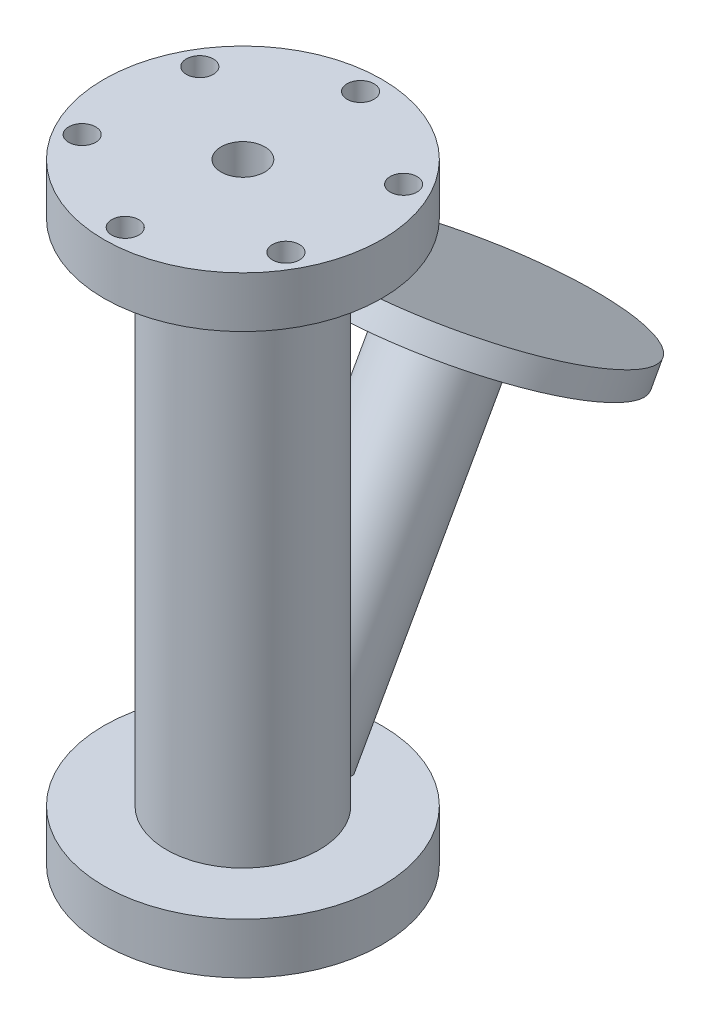
ISO-10303-21;
HEADER;
FILE_DESCRIPTION(('STEP AP214'),'2;1');
FILE_NAME('part.step','',(''),(''),'','','');
FILE_SCHEMA(('AUTOMOTIVE_DESIGN { 1 0 10303 214 1 1 1 1 }'));
ENDSEC;
DATA;
#1=APPLICATION_CONTEXT('core data for automotive mechanical design processes');
#2=APPLICATION_PROTOCOL_DEFINITION('international standard','automotive_design',2000,#1);
#3=PRODUCT_CONTEXT('',#1,'mechanical');
#4=PRODUCT('Part','Part','',(#3));
#5=PRODUCT_RELATED_PRODUCT_CATEGORY('part','',(#4));
#6=PRODUCT_DEFINITION_FORMATION('','',#4);
#7=PRODUCT_DEFINITION_CONTEXT('part definition',#1,'design');
#8=PRODUCT_DEFINITION('design','',#6,#7);
#9=PRODUCT_DEFINITION_SHAPE('','',#8);
#10=(LENGTH_UNIT() NAMED_UNIT(*) SI_UNIT(.MILLI.,.METRE.));
#11=(NAMED_UNIT(*) PLANE_ANGLE_UNIT() SI_UNIT($,.RADIAN.));
#12=(NAMED_UNIT(*) SI_UNIT($,.STERADIAN.) SOLID_ANGLE_UNIT());
#13=UNCERTAINTY_MEASURE_WITH_UNIT(LENGTH_MEASURE(1.E-05),#10,'distance_accuracy_value','');
#14=(GEOMETRIC_REPRESENTATION_CONTEXT(3) GLOBAL_UNCERTAINTY_ASSIGNED_CONTEXT((#13)) GLOBAL_UNIT_ASSIGNED_CONTEXT((#10,
#11,#12)) REPRESENTATION_CONTEXT('',''));
#15=CARTESIAN_POINT('',(0.,0.,0.));
#16=DIRECTION('',(0.,0.,1.));
#17=DIRECTION('',(1.,0.,0.));
#18=AXIS2_PLACEMENT_3D('',#15,#16,#17);
#19=CARTESIAN_POINT('',(0.,152.4,0.));
#20=DIRECTION('',(0.,-1.,0.));
#21=DIRECTION('',(0.,0.,-1.));
#22=AXIS2_PLACEMENT_3D('',#19,#20,#21);
#23=CYLINDRICAL_SURFACE('',#22,19.05);
#24=CARTESIAN_POINT('',(0.,25.8111800412419,0.));
#25=DIRECTION('',(0.,0.873081175094353,-0.487574878040147));
#26=DIRECTION('',(0.,-0.487574878040147,-0.873081175094353));
#27=AXIS2_PLACEMENT_3D('',#24,#25,#26);
#28=ELLIPSE('',#27,21.8192769967137,19.05);
#29=CARTESIAN_POINT('',(11.8901587608163,17.4992924424781,-14.8837705116205));
#30=VERTEX_POINT('',#29);
#31=CARTESIAN_POINT('',(-11.8901587608163,17.4992924424781,-14.8837705116205));
#32=VERTEX_POINT('',#31);
#33=EDGE_CURVE('E45',#30,#32,#28,.T.);
#34=ORIENTED_EDGE('',*,*,#33,.F.);
#35=CARTESIAN_POINT('',(11.8901587608163,17.4992924424781,-14.8837705116205));
#36=CARTESIAN_POINT('',(11.9715870961043,17.8279417549045,-14.8186671744751));
#37=CARTESIAN_POINT('',(12.0451097767677,18.1594892433178,-14.7588896927462));
#38=CARTESIAN_POINT('',(12.1779185235066,18.8268792067728,-14.6495257617463));
#39=CARTESIAN_POINT('',(12.2372135535328,19.1627188363624,-14.5999328986395));
#40=CARTESIAN_POINT('',(12.3430713660675,19.8365337253275,-14.5105393423938));
#41=CARTESIAN_POINT('',(12.3896741616893,20.1744987542862,-14.4707079164069));
#42=CARTESIAN_POINT('',(12.471799483745,20.8527462495922,-14.3999887879697));
#43=CARTESIAN_POINT('',(12.5073200571466,21.1930291136293,-14.3691026620281));
#44=CARTESIAN_POINT('',(12.5681592341849,21.8713036703718,-14.3159167533342));
#45=CARTESIAN_POINT('',(12.5935872817595,22.2092785439872,-14.2935249820681));
#46=CARTESIAN_POINT('',(12.6358278283109,22.8861808278136,-14.2561967890096));
#47=CARTESIAN_POINT('',(12.6526399084576,23.2251082835254,-14.2412607296471));
#48=CARTESIAN_POINT('',(12.6785357452392,23.9037818410074,-14.218211155744));
#49=CARTESIAN_POINT('',(12.6876126254117,24.2435284024887,-14.2101037118017));
#50=CARTESIAN_POINT('',(12.6987580726691,24.9232322870038,-14.2001441362731));
#51=CARTESIAN_POINT('',(12.7008263418991,25.2631896183807,-14.1982922705391));
#52=CARTESIAN_POINT('',(12.6982242035043,26.0532630733695,-14.2006203410835));
#53=CARTESIAN_POINT('',(12.6911520299332,26.5033653363735,-14.2069501606969));
#54=CARTESIAN_POINT('',(12.6670242756357,27.4031080535781,-14.2284660392265));
#55=CARTESIAN_POINT('',(12.6499678451866,27.8527484652092,-14.2436528519279));
#56=CARTESIAN_POINT('',(12.6067980590263,28.7513916608555,-14.2818756455167));
#57=CARTESIAN_POINT('',(12.5806818838169,29.2003942026281,-14.3049140698779));
#58=CARTESIAN_POINT('',(12.5201197932199,30.0974385427896,-14.3579496247138));
#59=CARTESIAN_POINT('',(12.4856734732221,30.5454802934442,-14.3879470931989));
#60=CARTESIAN_POINT('',(12.4089562117622,31.4410467392678,-14.45416470281));
#61=CARTESIAN_POINT('',(12.3666746679862,31.8885698970287,-14.4903932707813));
#62=CARTESIAN_POINT('',(12.2747267178258,32.7823803510185,-14.5683633740842));
#63=CARTESIAN_POINT('',(12.225060078081,33.2286676077402,-14.6101050836198));
#64=CARTESIAN_POINT('',(12.0654725688357,34.5653536581473,-14.7426603957691));
#65=CARTESIAN_POINT('',(11.9449462978121,35.4537811589725,-14.8408198664803));
#66=CARTESIAN_POINT('',(11.6747059434626,37.2383848664084,-15.054364291787));
#67=CARTESIAN_POINT('',(11.5245671808986,38.1344667786699,-15.1699933408827));
#68=CARTESIAN_POINT('',(11.1960356417333,39.9197589801686,-15.4140581804053));
#69=CARTESIAN_POINT('',(11.0176404321446,40.8089686707603,-15.5424950732833));
#70=CARTESIAN_POINT('',(10.6312848754542,42.5779714823624,-15.8092837071911));
#71=CARTESIAN_POINT('',(10.4233722598574,43.4577773870945,-15.9476192657415));
#72=CARTESIAN_POINT('',(10.086785754389,44.7701019172293,-16.1609657548616));
#73=CARTESIAN_POINT('',(9.97047661140706,45.2062926859898,-16.2330516377604));
#74=CARTESIAN_POINT('',(9.72901390520657,46.0759304612572,-16.3789104833221));
#75=CARTESIAN_POINT('',(9.60386062295878,46.5093775544521,-16.4526833923393));
#76=CARTESIAN_POINT('',(9.34295347917015,47.3765884445178,-16.6022441802185));
#77=CARTESIAN_POINT('',(9.20712322688314,47.8103273442765,-16.678043418014));
#78=CARTESIAN_POINT('',(8.92480357802452,48.6741240662725,-16.8308095964243));
#79=CARTESIAN_POINT('',(8.7783142051494,49.1041818966907,-16.9077765344428));
#80=CARTESIAN_POINT('',(8.47325953583915,49.9605884043151,-17.0626989342002));
#81=CARTESIAN_POINT('',(8.31467617334385,50.3869304288137,-17.1406557238553));
#82=CARTESIAN_POINT('',(7.98412219540868,51.2342882633586,-17.2971022135045));
#83=CARTESIAN_POINT('',(7.81215230483711,51.6553043603658,-17.3755918844338));
#84=CARTESIAN_POINT('',(7.45519560638654,52.4853118042064,-17.5316866339132));
#85=CARTESIAN_POINT('',(7.27040720889097,52.8943883289134,-17.6092899389742));
#86=CARTESIAN_POINT('',(6.88335765675255,53.7044356773851,-17.7641597112182));
#87=CARTESIAN_POINT('',(6.68109177946457,54.1054042739352,-17.8414260813949));
#88=CARTESIAN_POINT('',(6.25638256824934,54.8955215287215,-17.9947533628424));
#89=CARTESIAN_POINT('',(6.03399295490291,55.2846981586555,-18.0708168818901));
#90=CARTESIAN_POINT('',(5.68171614443727,55.8570859264192,-18.1833906471537));
#91=CARTESIAN_POINT('',(5.56120899708289,56.0459378944951,-18.2206521328643));
#92=CARTESIAN_POINT('',(5.31322700340744,56.4191319141357,-18.2945041952593));
#93=CARTESIAN_POINT('',(5.18575310971131,56.6034745773322,-18.3310948627612));
#94=CARTESIAN_POINT('',(4.93622222692405,56.9484516509797,-18.3997614413563));
#95=CARTESIAN_POINT('',(4.81490919793189,57.1096062783566,-18.4319213923655));
#96=CARTESIAN_POINT('',(4.56526603236721,57.4266284771416,-18.4953356497016));
#97=CARTESIAN_POINT('',(4.43693500807306,57.582495375634,-18.5265898406883));
#98=CARTESIAN_POINT('',(4.17226868244226,57.8880005313606,-18.5879842760556));
#99=CARTESIAN_POINT('',(4.03592060396509,58.0376281585937,-18.6181226102588));
#100=CARTESIAN_POINT('',(3.75456109129237,58.3288258612047,-18.6768957565539));
#101=CARTESIAN_POINT('',(3.60955087858278,58.4703970671822,-18.7055307795696));
#102=CARTESIAN_POINT('',(3.33233431013875,58.7230436607684,-18.7567270044383));
#103=CARTESIAN_POINT('',(3.20145846536657,58.8355125975228,-18.779555943288));
#104=CARTESIAN_POINT('',(2.93227968779908,59.0515320342979,-18.8234659604391));
#105=CARTESIAN_POINT('',(2.79397486043248,59.155080241616,-18.8445465893584));
#106=CARTESIAN_POINT('',(2.36777808948207,59.4489434951132,-18.9044479473269));
#107=CARTESIAN_POINT('',(2.06769710622343,59.623337567895,-18.9401027633173));
#108=CARTESIAN_POINT('',(1.54079964294662,59.8610315923743,-18.9887736241414));
#109=CARTESIAN_POINT('',(1.32232616005722,59.9420059112516,-19.0053787345966));
#110=CARTESIAN_POINT('',(0.874801980483771,60.067931160485,-19.0312171771626));
#111=CARTESIAN_POINT('',(0.645766303642175,60.1129316720493,-19.04046065544));
#112=CARTESIAN_POINT('',(0.181738759610341,60.1620567251936,-19.0505518793704));
#113=CARTESIAN_POINT('',(-0.053279216897515,60.1659517153694,-19.051352476223));
#114=CARTESIAN_POINT('',(-0.520150292816191,60.1317788725804,-19.0443320402756));
#115=CARTESIAN_POINT('',(-0.752001156490451,60.0936828049751,-19.0365052064213));
#116=CARTESIAN_POINT('',(-1.24052429353942,59.9712353039521,-19.0113735371682));
#117=CARTESIAN_POINT('',(-1.49554399452883,59.8806815016804,-18.992798287442));
#118=CARTESIAN_POINT('',(-1.98724863842851,59.6603645758905,-18.9476834810053));
#119=CARTESIAN_POINT('',(-2.22389818895371,59.5305280151893,-18.9211290081717));
#120=CARTESIAN_POINT('',(-2.63366955474983,59.27004995252,-18.8679700182152));
#121=CARTESIAN_POINT('',(-2.81021222381858,59.1444456791825,-18.8423735096073));
#122=CARTESIAN_POINT('',(-3.1515344696312,58.878590397379,-18.788299835488));
#123=CARTESIAN_POINT('',(-3.3163059526409,58.738329471296,-18.7598207198367));
#124=CARTESIAN_POINT('',(-3.63531782232094,58.446162564386,-18.7006241123633));
#125=CARTESIAN_POINT('',(-3.78953437434216,58.2942317719384,-18.669901858601));
#126=CARTESIAN_POINT('',(-4.08812662438086,57.9814485639364,-18.6067994067665));
#127=CARTESIAN_POINT('',(-4.23250459217522,57.8205982217733,-18.574419594135));
#128=CARTESIAN_POINT('',(-4.5602928708425,57.4356552706281,-18.4971213103156));
#129=CARTESIAN_POINT('',(-4.74021888753124,57.2087055064594,-18.4516932625175));
#130=CARTESIAN_POINT('',(-5.08662937350622,56.7450233524136,-18.3592161705258));
#131=CARTESIAN_POINT('',(-5.25310781528372,56.5082866468913,-18.3121664127773));
#132=CARTESIAN_POINT('',(-5.57462051446701,56.026895844268,-18.2168672351441));
#133=CARTESIAN_POINT('',(-5.72963672833075,55.7822301009943,-18.1686160771863));
#134=CARTESIAN_POINT('',(-6.02945085813426,55.2868600334102,-18.0713323106331));
#135=CARTESIAN_POINT('',(-6.17424763009977,55.0361550372598,-18.0222996153024));
#136=CARTESIAN_POINT('',(-6.45555334778775,54.5285499179156,-17.923466863976));
#137=CARTESIAN_POINT('',(-6.59201528970093,54.2716243621255,-17.8736641437643));
#138=CARTESIAN_POINT('',(-6.85684423543422,53.7536994650449,-17.7737505939149));
#139=CARTESIAN_POINT('',(-6.98521104696395,53.4927000271678,-17.7236397569892));
#140=CARTESIAN_POINT('',(-7.23455950529658,52.9675480879274,-17.6233279412957));
#141=CARTESIAN_POINT('',(-7.35554832171537,52.7033989557292,-17.5731271004604));
#142=CARTESIAN_POINT('',(-7.59096875199512,52.1722014539873,-17.4727232584136));
#143=CARTESIAN_POINT('',(-7.70540031192555,51.90515306062,-17.4225202571878));
#144=CARTESIAN_POINT('',(-7.98680323930297,51.2277046658539,-17.2959027262633));
#145=CARTESIAN_POINT('',(-8.14982004858555,50.8156457400855,-17.2195634677227));
#146=CARTESIAN_POINT('',(-8.46365383872284,49.9867750013043,-17.0674965609188));
#147=CARTESIAN_POINT('',(-8.61446960798947,49.5699627209514,-16.9917689740661));
#148=CARTESIAN_POINT('',(-8.9052334618656,48.7322507548765,-16.841203173584));
#149=CARTESIAN_POINT('',(-9.0451778206311,48.3113497229755,-16.7663652722448));
#150=CARTESIAN_POINT('',(-9.31517818830302,47.4661678425298,-16.6178724340436));
#151=CARTESIAN_POINT('',(-9.44523373457829,47.0418868368834,-16.5442175526542));
#152=CARTESIAN_POINT('',(-9.69652514712688,46.1895509134244,-16.3982029260995));
#153=CARTESIAN_POINT('',(-9.81774274757546,45.7614901213465,-16.3258460839164));
#154=CARTESIAN_POINT('',(-10.0517248807894,44.9027773953744,-16.1828336211435));
#155=CARTESIAN_POINT('',(-10.1644891638221,44.4721253853348,-16.1121780508554));
#156=CARTESIAN_POINT('',(-10.4908699791876,43.1768958153415,-15.9031770813175));
#157=CARTESIAN_POINT('',(-10.6926357091407,42.3088348309506,-15.7677612672885));
#158=CARTESIAN_POINT('',(-11.0678453845719,40.5632316619512,-15.5066925609503));
#159=CARTESIAN_POINT('',(-11.2412282860842,39.6856732597412,-15.381061008294));
#160=CARTESIAN_POINT('',(-11.5606086247962,37.9237888611776,-15.1424747234139));
#161=CARTESIAN_POINT('',(-11.7066035723371,37.039462257169,-15.0295211440358));
#162=CARTESIAN_POINT('',(-11.9711663746262,35.2661555346694,-14.8196532242036));
#163=CARTESIAN_POINT('',(-12.0897753928827,34.3771844814613,-14.722714874646));
#164=CARTESIAN_POINT('',(-12.2463603372269,33.039861985236,-14.5922497918671));
#165=CARTESIAN_POINT('',(-12.2949988113337,32.5934640834741,-14.5512533770863));
#166=CARTESIAN_POINT('',(-12.384842004909,31.6994473940215,-14.4748634366939));
#167=CARTESIAN_POINT('',(-12.4260469645689,31.2518286462533,-14.4394697300524));
#168=CARTESIAN_POINT('',(-12.5009051805932,30.351770379817,-14.3747117942973));
#169=CARTESIAN_POINT('',(-12.5344931221014,29.8993216211787,-14.3453998851076));
#170=CARTESIAN_POINT('',(-12.5930802887585,28.9934725365682,-14.2939970095068));
#171=CARTESIAN_POINT('',(-12.6180799435192,28.5400722593358,-14.2719056819036));
#172=CARTESIAN_POINT('',(-12.6587282117493,27.6322047930218,-14.2358646535397));
#173=CARTESIAN_POINT('',(-12.6743703803687,27.1777370845427,-14.22192056424));
#174=CARTESIAN_POINT('',(-12.6952714637061,26.2683634934976,-14.2032667299861));
#175=CARTESIAN_POINT('',(-12.700530527499,25.8134576173165,-14.1985568524521));
#176=CARTESIAN_POINT('',(-12.6993900671482,24.9076451830173,-14.1995774813634));
#177=CARTESIAN_POINT('',(-12.6930924810949,24.4567385723364,-14.2052167012384));
#178=CARTESIAN_POINT('',(-12.6674627414869,23.5555163460316,-14.2280778461266));
#179=CARTESIAN_POINT('',(-12.6481293866781,23.1052007887057,-14.2453008385912));
#180=CARTESIAN_POINT('',(-12.5944959138787,22.2066747485252,-14.2927416295262));
#181=CARTESIAN_POINT('',(-12.560214197644,21.7584623601459,-14.3229434501196));
#182=CARTESIAN_POINT('',(-12.4742857534683,20.8649806682414,-14.3978471408625));
#183=CARTESIAN_POINT('',(-12.4226447070725,20.4197104503274,-14.4425442666666));
#184=CARTESIAN_POINT('',(-12.3317300966062,19.7679687309619,-14.5200672958482));
#185=CARTESIAN_POINT('',(-12.3003392485936,19.5596338223258,-14.5466869138461));
#186=CARTESIAN_POINT('',(-12.2326952026947,19.1442700408568,-14.6036170404551));
#187=CARTESIAN_POINT('',(-12.1964423810172,18.9372410682699,-14.6339272634785));
#188=CARTESIAN_POINT('',(-12.1185492313261,18.5239226256769,-14.6984981912093));
#189=CARTESIAN_POINT('',(-12.0768876336022,18.3176395677883,-14.7327744308951));
#190=CARTESIAN_POINT('',(-11.9878832930777,17.9069566889685,-14.8052823811337));
#191=CARTESIAN_POINT('',(-11.9405392940406,17.7025572952627,-14.8435149660769));
#192=CARTESIAN_POINT('',(-11.8901587608163,17.4992924424781,-14.8837705116205));
#193=B_SPLINE_CURVE_WITH_KNOTS('',3,(#35,#36,#37,#38,#39,#40,#41,#42,#43,#44,#45,#46,#47,#48,
#49,#50,#51,#52,#53,#54,#55,#56,#57,#58,#59,#60,#61,#62,#63,#64,#65,#66,#67,#68,#69,#70,#71,#72,
#73,#74,#75,#76,#77,#78,#79,#80,#81,#82,#83,#84,#85,#86,#87,#88,#89,#90,#91,#92,#93,#94,#95,#96,
#97,#98,#99,#100,#101,#102,#103,#104,#105,#106,#107,#108,#109,#110,#111,#112,#113,#114,#115,
#116,#117,#118,#119,#120,#121,#122,#123,#124,#125,#126,#127,#128,#129,#130,#131,#132,#133,#134,
#135,#136,#137,#138,#139,#140,#141,#142,#143,#144,#145,#146,#147,#148,#149,#150,#151,#152,#153,
#154,#155,#156,#157,#158,#159,#160,#161,#162,#163,#164,#165,#166,#167,#168,#169,#170,#171,#172,
#173,#174,#175,#176,#177,#178,#179,#180,#181,#182,#183,#184,#185,#186,#187,#188,#189,#190,#191,
#192),.UNSPECIFIED.,.F.,.F.,(4,2,2,2,2,2,2,2,2,2,2,2,2,2,2,2,2,2,2,2,2,2,2,2,2,2,2,2,2,2,2,2,2,
2,2,2,2,2,2,2,2,2,2,2,2,2,2,2,2,2,2,2,2,2,2,2,2,2,2,2,2,2,2,2,2,2,2,2,2,2,2,2,2,2,2,2,2,2,4),
(0.,1.03406332313849,2.06747342699304,3.09758689942503,4.12788180748228,5.14667710377891,
6.16552191995318,7.18527152993864,8.20506447711441,9.55543645137762,10.9059233674593,
12.256830948413,13.6078041585535,14.9606189807651,16.3134765594114,19.0185747515098,
21.7657321494962,24.5131262168976,27.2561271347331,28.6275006394675,29.9988305964072,
31.3810667899194,32.7632999106497,34.1476398619432,35.5319049045651,36.8981644064409,
38.264794251071,39.6278778188982,40.3090644793265,40.990158226986,41.60277371769,
42.2154668795215,42.8291644772201,43.4427757380636,43.9645783921578,44.4865147563261,
45.5266322217036,46.2248363838445,46.922076572951,47.6232084127279,48.3248119788503,
49.1341076173713,49.9449256418388,50.5985314708926,51.2525824705671,51.9080647542759,
52.5633953016188,53.4422587009581,54.3215138658665,55.2021248983658,56.0828343514836,
56.9681227570835,57.8534321837615,58.7378671261271,59.6223093415363,60.9710543963402,
62.3199332202903,63.6692723102717,65.01867448798,66.3707908172295,67.7229470757477,
70.4265952230894,73.1359839041895,75.8456187587724,78.5511538832024,79.9037972502259,
81.2563969028887,82.6201898065832,83.9839144793521,85.3485773220723,86.7132205715814,
88.0658844831396,89.4186730605463,90.7698010067704,92.1204871714019,92.7574971750428,
93.3944579166498,94.0340039699501,94.6736916722061),.UNSPECIFIED.);
#194=EDGE_CURVE('E73',#30,#32,#193,.T.);
#195=ORIENTED_EDGE('',*,*,#194,.T.);
#196=EDGE_LOOP('',(#34,#195));
#197=FACE_BOUND('',#196,.T.);
#198=CARTESIAN_POINT('',(0.,121.815998826782,0.));
#199=DIRECTION('',(0.,0.873081175094353,-0.487574878040146));
#200=DIRECTION('',(0.,-0.487574878040146,-0.873081175094353));
#201=AXIS2_PLACEMENT_3D('',#198,#199,#200);
#202=ELLIPSE('',#201,21.8192769967137,19.05);
#203=CARTESIAN_POINT('',(1.82072987348623,111.226169638299,-18.9627910057511));
#204=VERTEX_POINT('',#203);
#205=CARTESIAN_POINT('',(-1.82072987348623,111.226169638299,-18.9627910057511));
#206=VERTEX_POINT('',#205);
#207=EDGE_CURVE('E118',#204,#206,#202,.T.);
#208=ORIENTED_EDGE('',*,*,#207,.F.);
#209=CARTESIAN_POINT('',(1.82072987348621,111.226169638299,-18.9627910057511));
#210=CARTESIAN_POINT('',(1.64072810083788,111.275022847269,-18.9800961468672));
#211=CARTESIAN_POINT('',(1.4585808700557,111.317048184039,-18.9949771003709));
#212=CARTESIAN_POINT('',(1.09110163813631,111.386640354328,-19.0196137681561));
#213=CARTESIAN_POINT('',(0.905767837223356,111.414198720022,-19.0293664807752));
#214=CARTESIAN_POINT('',(0.537662652428811,111.453522134386,-19.0432815249605));
#215=CARTESIAN_POINT('',(0.354935081458713,111.465647032295,-19.047571234051));
#216=CARTESIAN_POINT('',(-0.0108347709802493,111.474984643188,-19.0508748624426));
#217=CARTESIAN_POINT('',(-0.193876851400692,111.472204749578,-19.0498913974601));
#218=CARTESIAN_POINT('',(-0.618883416869515,111.448444385787,-19.041484752405));
#219=CARTESIAN_POINT('',(-0.86052497243449,111.421804718527,-19.0320592269167));
#220=CARTESIAN_POINT('',(-1.22134124594174,111.362873479925,-19.0112001114645));
#221=CARTESIAN_POINT('',(-1.34231509566018,111.339800597403,-19.0030323332606));
#222=CARTESIAN_POINT('',(-1.58272715884408,111.287517511526,-18.9845199413564));
#223=CARTESIAN_POINT('',(-1.70216579294156,111.258309029008,-18.9741759380158));
#224=CARTESIAN_POINT('',(-1.82072987348622,111.226169638299,-18.9627910057511));
#225=B_SPLINE_CURVE_WITH_KNOTS('',3,(#209,#210,#211,#212,#213,#214,#215,#216,#217,#218,#219,
#220,#221,#222,#223,#224),.UNSPECIFIED.,.F.,.F.,(4,2,2,2,2,2,2,4),(0.,0.561878672175372,
1.12408585815795,1.67292887763112,2.22149967306117,2.94961585729036,3.31974006585666,
3.6897606047928),.UNSPECIFIED.);
#226=EDGE_CURVE('E39',#204,#206,#225,.T.);
#227=ORIENTED_EDGE('',*,*,#226,.T.);
#228=EDGE_LOOP('',(#208,#227));
#229=FACE_BOUND('',#228,.T.);
#230=CARTESIAN_POINT('',(0.,12.7,0.));
#231=DIRECTION('',(0.,-1.,0.));
#232=DIRECTION('',(0.,0.,-1.));
#233=AXIS2_PLACEMENT_3D('',#230,#231,#232);
#234=CIRCLE('',#233,19.05);
#235=CARTESIAN_POINT('',(0.,12.7,-19.05));
#236=VERTEX_POINT('',#235);
#237=EDGE_CURVE('E124',#236,#236,#234,.T.);
#238=ORIENTED_EDGE('',*,*,#237,.F.);
#239=EDGE_LOOP('',(#238));
#240=FACE_BOUND('',#239,.T.);
#241=CARTESIAN_POINT('',(0.,139.7,0.));
#242=DIRECTION('',(0.,1.,0.));
#243=DIRECTION('',(0.,0.,1.));
#244=AXIS2_PLACEMENT_3D('',#241,#242,#243);
#245=CIRCLE('',#244,19.05);
#246=CARTESIAN_POINT('',(0.,139.7,19.05));
#247=VERTEX_POINT('',#246);
#248=EDGE_CURVE('E121',#247,#247,#245,.T.);
#249=ORIENTED_EDGE('',*,*,#248,.F.);
#250=EDGE_LOOP('',(#249));
#251=FACE_BOUND('',#250,.T.);
#252=ADVANCED_FACE('F31',(#197,#229,#240,#251),#23,.T.);
#253=CARTESIAN_POINT('',(0.,152.4,0.));
#254=DIRECTION('',(0.,1.,0.));
#255=DIRECTION('',(0.,0.,1.));
#256=AXIS2_PLACEMENT_3D('',#253,#254,#255);
#257=PLANE('',#256);
#258=CARTESIAN_POINT('',(-25.42858431608,152.4,-14.6812000000003));
#259=DIRECTION('',(0.,-1.,0.));
#260=DIRECTION('',(-0.866025403784433,0.,-0.50000000000001));
#261=AXIS2_PLACEMENT_3D('',#258,#259,#260);
#262=CIRCLE('',#261,3.3655);
#263=CARTESIAN_POINT('',(-28.3431928125165,152.4,-16.3639500000003));
#264=VERTEX_POINT('',#263);
#265=EDGE_CURVE('E173',#264,#264,#262,.T.);
#266=ORIENTED_EDGE('',*,*,#265,.T.);
#267=EDGE_LOOP('',(#266));
#268=FACE_BOUND('',#267,.T.);
#269=CARTESIAN_POINT('',(-25.4285843160803,152.4,14.6811999999998));
#270=DIRECTION('',(0.,-1.,0.));
#271=DIRECTION('',(-0.866025403784443,0.,0.499999999999992));
#272=AXIS2_PLACEMENT_3D('',#269,#270,#271);
#273=CIRCLE('',#272,3.3655);
#274=CARTESIAN_POINT('',(-28.3431928125169,152.4,16.3639499999997));
#275=VERTEX_POINT('',#274);
#276=EDGE_CURVE('E167',#275,#275,#273,.T.);
#277=ORIENTED_EDGE('',*,*,#276,.T.);
#278=EDGE_LOOP('',(#277));
#279=FACE_BOUND('',#278,.T.);
#280=CARTESIAN_POINT('',(-2.06666602711389E-13,152.4,29.3624));
#281=DIRECTION('',(0.,-1.,0.));
#282=DIRECTION('',(0.,0.,1.));
#283=AXIS2_PLACEMENT_3D('',#280,#281,#282);
#284=CIRCLE('',#283,3.3655);
#285=CARTESIAN_POINT('',(-2.30167777215016E-13,152.4,32.7279));
#286=VERTEX_POINT('',#285);
#287=EDGE_CURVE('E161',#286,#286,#284,.T.);
#288=ORIENTED_EDGE('',*,*,#287,.T.);
#289=EDGE_LOOP('',(#288));
#290=FACE_BOUND('',#289,.T.);
#291=CARTESIAN_POINT('',(25.4285843160801,152.4,14.6812000000001));
#292=DIRECTION('',(0.,-1.,0.));
#293=DIRECTION('',(0.866025403784436,0.,0.500000000000004));
#294=AXIS2_PLACEMENT_3D('',#291,#292,#293);
#295=CIRCLE('',#294,3.3655);
#296=CARTESIAN_POINT('',(28.3431928125167,152.4,16.3639500000001));
#297=VERTEX_POINT('',#296);
#298=EDGE_CURVE('E155',#297,#297,#295,.T.);
#299=ORIENTED_EDGE('',*,*,#298,.T.);
#300=EDGE_LOOP('',(#299));
#301=FACE_BOUND('',#300,.T.);
#302=CARTESIAN_POINT('',(25.4285843160802,152.4,-14.6811999999999));
#303=DIRECTION('',(0.,-1.,0.));
#304=DIRECTION('',(0.86602540378444,0.,-0.499999999999998));
#305=AXIS2_PLACEMENT_3D('',#302,#303,#304);
#306=CIRCLE('',#305,3.3655);
#307=CARTESIAN_POINT('',(28.3431928125168,152.4,-16.3639499999999));
#308=VERTEX_POINT('',#307);
#309=EDGE_CURVE('E149',#308,#308,#306,.T.);
#310=ORIENTED_EDGE('',*,*,#309,.T.);
#311=EDGE_LOOP('',(#310));
#312=FACE_BOUND('',#311,.T.);
#313=CARTESIAN_POINT('',(0.,152.4,-29.3624));
#314=DIRECTION('',(0.,-1.,0.));
#315=DIRECTION('',(0.,0.,-1.));
#316=AXIS2_PLACEMENT_3D('',#313,#314,#315);
#317=CIRCLE('',#316,3.3655);
#318=CARTESIAN_POINT('',(0.,152.4,-32.7279));
#319=VERTEX_POINT('',#318);
#320=EDGE_CURVE('E143',#319,#319,#317,.T.);
#321=ORIENTED_EDGE('',*,*,#320,.T.);
#322=EDGE_LOOP('',(#321));
#323=FACE_BOUND('',#322,.T.);
#324=CARTESIAN_POINT('',(0.,152.4,0.));
#325=DIRECTION('',(0.,1.,0.));
#326=DIRECTION('',(0.,0.,1.));
#327=AXIS2_PLACEMENT_3D('',#324,#325,#326);
#328=CIRCLE('',#327,5.461);
#329=CARTESIAN_POINT('',(0.,152.4,5.461));
#330=VERTEX_POINT('',#329);
#331=EDGE_CURVE('E127',#330,#330,#328,.T.);
#332=ORIENTED_EDGE('',*,*,#331,.F.);
#333=EDGE_LOOP('',(#332));
#334=FACE_BOUND('',#333,.T.);
#335=CARTESIAN_POINT('',(0.,152.4,0.));
#336=DIRECTION('',(0.,1.,0.));
#337=DIRECTION('',(0.,0.,1.));
#338=AXIS2_PLACEMENT_3D('',#335,#336,#337);
#339=CIRCLE('',#338,34.671);
#340=CARTESIAN_POINT('',(0.,152.4,34.671));
#341=VERTEX_POINT('',#340);
#342=EDGE_CURVE('E140',#341,#341,#339,.T.);
#343=ORIENTED_EDGE('',*,*,#342,.T.);
#344=EDGE_LOOP('',(#343));
#345=FACE_BOUND('',#344,.T.);
#346=ADVANCED_FACE('F192',(#268,#279,#290,#301,#312,#323,#334,#345),#257,.T.);
#347=CARTESIAN_POINT('',(0.,0.,0.));
#348=DIRECTION('',(0.,1.,0.));
#349=DIRECTION('',(0.,0.,1.));
#350=AXIS2_PLACEMENT_3D('',#347,#348,#349);
#351=PLANE('',#350);
#352=CARTESIAN_POINT('',(0.,0.,0.));
#353=DIRECTION('',(0.,-1.,0.));
#354=DIRECTION('',(0.,0.,-1.));
#355=AXIS2_PLACEMENT_3D('',#352,#353,#354);
#356=CIRCLE('',#355,34.671);
#357=CARTESIAN_POINT('',(0.,0.,-34.671));
#358=VERTEX_POINT('',#357);
#359=EDGE_CURVE('E134',#358,#358,#356,.T.);
#360=ORIENTED_EDGE('',*,*,#359,.T.);
#361=EDGE_LOOP('',(#360));
#362=FACE_BOUND('',#361,.T.);
#363=CARTESIAN_POINT('',(0.,0.,0.));
#364=DIRECTION('',(0.,1.,0.));
#365=DIRECTION('',(0.,0.,1.));
#366=AXIS2_PLACEMENT_3D('',#363,#364,#365);
#367=CIRCLE('',#366,5.461);
#368=CARTESIAN_POINT('',(0.,0.,5.461));
#369=VERTEX_POINT('',#368);
#370=EDGE_CURVE('E128',#369,#369,#367,.T.);
#371=ORIENTED_EDGE('',*,*,#370,.T.);
#372=EDGE_LOOP('',(#371));
#373=FACE_BOUND('',#372,.T.);
#374=ADVANCED_FACE('F224',(#362,#373),#351,.F.);
#375=CARTESIAN_POINT('',(0.,152.4,0.));
#376=DIRECTION('',(0.,-1.,0.));
#377=DIRECTION('',(0.,0.,-1.));
#378=AXIS2_PLACEMENT_3D('',#375,#376,#377);
#379=CYLINDRICAL_SURFACE('',#378,5.461);
#380=CARTESIAN_POINT('',(5.37894274348046,25.2844856579558,-0.943130935956863));
#381=CARTESIAN_POINT('',(5.36491940061002,25.4411060389186,-1.02308765669924));
#382=CARTESIAN_POINT('',(5.34919841445686,25.5979501168452,-1.10229329938833));
#383=CARTESIAN_POINT('',(5.31443976406465,25.9119899060313,-1.25925381998599));
#384=CARTESIAN_POINT('',(5.29540221313405,26.0691856050968,-1.33700874735693));
#385=CARTESIAN_POINT('',(5.23342977779761,26.54118191014,-1.56818722175603));
#386=CARTESIAN_POINT('',(5.18563595176626,26.856382424751,-1.71951972558952));
#387=CARTESIAN_POINT('',(5.07683924727137,27.4900549464261,-2.01835253330751));
#388=CARTESIAN_POINT('',(5.01571532307754,27.8085296138144,-2.16580284269802));
#389=CARTESIAN_POINT('',(4.88035886396888,28.4449834828176,-2.45564711205421));
#390=CARTESIAN_POINT('',(4.80612691245519,28.7629627058481,-2.59804129671504));
#391=CARTESIAN_POINT('',(4.63783135806354,29.4213889224078,-2.8884772540392));
#392=CARTESIAN_POINT('',(4.54269724342,29.761730352895,-3.03614037544979));
#393=CARTESIAN_POINT('',(4.33505223603216,30.4394842404026,-3.3259071069969));
#394=CARTESIAN_POINT('',(4.22254342999417,30.7768970440192,-3.46801138218748));
#395=CARTESIAN_POINT('',(4.03904869113589,31.2787008114111,-3.67656095932076));
#396=CARTESIAN_POINT('',(3.97555999637295,31.4449447633209,-3.74518649017086));
#397=CARTESIAN_POINT('',(3.84316111594573,31.7758751086077,-3.88093206168815));
#398=CARTESIAN_POINT('',(3.77425136677642,31.9405616261933,-3.94805222300726));
#399=CARTESIAN_POINT('',(3.63048630831999,32.2678474200814,-4.0806428121477));
#400=CARTESIAN_POINT('',(3.55563511423926,32.4304480520013,-4.14611434116306));
#401=CARTESIAN_POINT('',(3.39922102088948,32.7530893188138,-4.27529053831497));
#402=CARTESIAN_POINT('',(3.31765904015486,32.913130300487,-4.33899544666586));
#403=CARTESIAN_POINT('',(3.15044478660336,33.2232613812893,-4.46178499329022));
#404=CARTESIAN_POINT('',(3.06510658890573,33.3734876106738,-4.52095141259698));
#405=CARTESIAN_POINT('',(2.88628213825218,33.6699804889868,-4.63716281608708));
#406=CARTESIAN_POINT('',(2.79279275474352,33.816245588083,-4.69420697308542));
#407=CARTESIAN_POINT('',(2.59710410983489,34.1021704666656,-4.80521914087702));
#408=CARTESIAN_POINT('',(2.4949819384254,34.2418743207545,-4.85920841115094));
#409=CARTESIAN_POINT('',(2.27970337161984,34.5137572137845,-4.96384937015725));
#410=CARTESIAN_POINT('',(2.16655606376655,34.6459423101257,-5.01450375093766));
#411=CARTESIAN_POINT('',(1.93799938715311,34.8879437742241,-5.10690175470967));
#412=CARTESIAN_POINT('',(1.82375575180864,34.9986992550097,-5.14903642971481));
#413=CARTESIAN_POINT('',(1.58232273400591,35.2076063743227,-5.22828082225482));
#414=CARTESIAN_POINT('',(1.4551288237164,35.305753577278,-5.26538877164438));
#415=CARTESIAN_POINT('',(1.20568673055667,35.4705706844395,-5.32755917268128));
#416=CARTESIAN_POINT('',(1.08536142218045,35.5397378919933,-5.35358660097993));
#417=CARTESIAN_POINT('',(0.834298513897438,35.658973106182,-5.39838950419562));
#418=CARTESIAN_POINT('',(0.703583347463479,35.709080979896,-5.41718011765606));
#419=CARTESIAN_POINT('',(0.462649269249115,35.7764241638172,-5.44241504717186));
#420=CARTESIAN_POINT('',(0.353950445083223,35.7983732168036,-5.4506310505771));
#421=CARTESIAN_POINT('',(0.134164743060035,35.8246246808703,-5.46045632092955));
#422=CARTESIAN_POINT('',(0.0230800004375881,35.8289422594539,-5.46207126644823));
#423=CARTESIAN_POINT('',(-0.198171935760135,35.8194655219052,-5.45852518306255));
#424=CARTESIAN_POINT('',(-0.308339197095525,35.8056725554722,-5.45336465910416));
#425=CARTESIAN_POINT('',(-0.524809556760053,35.7614692371809,-5.43681198078071));
#426=CARTESIAN_POINT('',(-0.631108344974659,35.7310409209954,-5.42541308965919));
#427=CARTESIAN_POINT('',(-0.877527047211614,35.6418722929745,-5.39196669157065));
#428=CARTESIAN_POINT('',(-1.01498420145133,35.5767495376475,-5.36751191858472));
#429=CARTESIAN_POINT('',(-1.27728625812034,35.4272452192426,-5.31123242161729));
#430=CARTESIAN_POINT('',(-1.40210087666364,35.3428189206078,-5.27939057569827));
#431=CARTESIAN_POINT('',(-1.62509185665814,35.1718497056948,-5.21472334614925));
#432=CARTESIAN_POINT('',(-1.72465550212073,35.0868494613976,-5.18250261554906));
#433=CARTESIAN_POINT('',(-1.91566318623637,34.90921133741,-5.11498076065542));
#434=CARTESIAN_POINT('',(-2.00710046574051,34.8165672211238,-5.07967711963229));
#435=CARTESIAN_POINT('',(-2.18300144206109,34.6253857208918,-5.00660713528261));
#436=CARTESIAN_POINT('',(-2.26744692067387,34.5268340274557,-4.9688347904401));
#437=CARTESIAN_POINT('',(-2.42999122043525,34.3254307864676,-4.89139638980852));
#438=CARTESIAN_POINT('',(-2.50809194869073,34.2225805451567,-4.85173090879225));
#439=CARTESIAN_POINT('',(-2.68921111322411,33.9712666508989,-4.75448223986631));
#440=CARTESIAN_POINT('',(-2.78954404577625,33.8211668635416,-4.69613617867896));
#441=CARTESIAN_POINT('',(-2.9810443464976,33.5161412365003,-4.57696436110515));
#442=CARTESIAN_POINT('',(-3.07220755369505,33.3612132473034,-4.51613749643603));
#443=CARTESIAN_POINT('',(-3.24676054369895,33.047556406899,-4.39232624307962));
#444=CARTESIAN_POINT('',(-3.33013828676037,32.8888221307366,-4.32933871217854));
#445=CARTESIAN_POINT('',(-3.48998267690644,32.5686095882353,-4.20154834867254));
#446=CARTESIAN_POINT('',(-3.56644815972098,32.4071308650554,-4.13674521265423));
#447=CARTESIAN_POINT('',(-3.71370067641373,32.0810383779518,-4.00509225287341));
#448=CARTESIAN_POINT('',(-3.78444870232781,31.9164112395779,-3.93823207026112));
#449=CARTESIAN_POINT('',(-3.92034397248573,31.5854797104701,-3.8029728641843));
#450=CARTESIAN_POINT('',(-3.98549069884303,31.419175166231,-3.73457369916417));
#451=CARTESIAN_POINT('',(-4.17317157423706,30.9186136274119,-3.52731737284307));
#452=CARTESIAN_POINT('',(-4.28809059614505,30.5823831824625,-3.38627022362591));
#453=CARTESIAN_POINT('',(-4.45933876411854,30.0372383503478,-3.1541724894151));
#454=CARTESIAN_POINT('',(-4.52116107835914,29.829277172722,-3.06483878806798));
#455=CARTESIAN_POINT('',(-4.63856025470461,29.412498902477,-2.88407616350252));
#456=CARTESIAN_POINT('',(-4.69413696299535,29.2036817889094,-2.79264718874939));
#457=CARTESIAN_POINT('',(-4.85202093391587,28.5762446258837,-2.51511866020526));
#458=CARTESIAN_POINT('',(-4.9454457314696,28.1567559049285,-2.32582721268774));
#459=CARTESIAN_POINT('',(-5.06771237865192,27.5323097945016,-2.03747955650203));
#460=CARTESIAN_POINT('',(-5.10513996030572,27.3274095269356,-1.94181113861043));
#461=CARTESIAN_POINT('',(-5.17462270825618,26.9177409203971,-1.74825166273646));
#462=CARTESIAN_POINT('',(-5.20667794281772,26.7129725797812,-1.65036063301414));
#463=CARTESIAN_POINT('',(-5.2653505709984,26.3039151652584,-1.45233219758438));
#464=CARTESIAN_POINT('',(-5.29197158041748,26.0996258626643,-1.35219633509142));
#465=CARTESIAN_POINT('',(-5.33965934530048,25.6915925572435,-1.14950465760067));
#466=CARTESIAN_POINT('',(-5.3607259141168,25.487848572969,-1.04694876140786));
#467=CARTESIAN_POINT('',(-5.37894274348046,25.2844856579558,-0.943130935956864));
#468=B_SPLINE_CURVE_WITH_KNOTS('',3,(#380,#381,#382,#383,#384,#385,#386,#387,#388,#389,#390,
#391,#392,#393,#394,#395,#396,#397,#398,#399,#400,#401,#402,#403,#404,#405,#406,#407,#408,#409,
#410,#411,#412,#413,#414,#415,#416,#417,#418,#419,#420,#421,#422,#423,#424,#425,#426,#427,#428,
#429,#430,#431,#432,#433,#434,#435,#436,#437,#438,#439,#440,#441,#442,#443,#444,#445,#446,#447,
#448,#449,#450,#451,#452,#453,#454,#455,#456,#457,#458,#459,#460,#461,#462,#463,#464,#465,#466,
#467),.UNSPECIFIED.,.F.,.F.,(4,2,2,2,2,2,2,2,2,2,2,2,2,2,2,2,2,2,2,2,2,2,2,2,2,2,2,2,2,2,2,2,2,
2,2,2,2,2,2,2,2,2,2,4),(0.,0.529200690451462,1.05838330462204,2.11677991761608,3.18522038232536,
4.25361330575684,5.40222084596716,6.55069054515313,7.12280451984333,7.69487247585216,
8.26654760270304,8.8381446116587,9.38581782987703,9.93370232245842,10.4771271950914,
11.0201078753435,11.5131356269272,12.0063363526525,12.4285540662935,12.8498836908854,
13.1820069840785,13.5138445074271,13.8456573017872,14.1778291268679,14.6373857804307,
15.098018439884,15.5018918697857,15.9060981397378,16.311326494859,16.7164325921485,
17.2852542545515,17.8543328792091,18.4242774588114,18.9943178591426,19.5679665718606,
20.1416682662453,21.2879351096071,21.9917410752702,22.6955643701706,24.1036074682863,
24.7911865001072,25.4787567943945,26.1658680942788,26.853002480436),.UNSPECIFIED.);
#469=CARTESIAN_POINT('',(5.37894274348046,25.2844856579558,-0.943130935956861));
#470=VERTEX_POINT('',#469);
#471=CARTESIAN_POINT('',(-5.37894274348046,25.2844856579558,-0.943130935956861));
#472=VERTEX_POINT('',#471);
#473=EDGE_CURVE('E68',#470,#472,#468,.T.);
#474=ORIENTED_EDGE('',*,*,#473,.F.);
#475=CARTESIAN_POINT('',(0.,25.8111800412419,0.));
#476=DIRECTION('',(0.,0.873081175094353,-0.487574878040147));
#477=DIRECTION('',(0.,-0.487574878040147,-0.873081175094353));
#478=AXIS2_PLACEMENT_3D('',#475,#476,#477);
#479=ELLIPSE('',#478,6.2548594057246,5.461);
#480=EDGE_CURVE('E11',#470,#472,#479,.T.);
#481=ORIENTED_EDGE('',*,*,#480,.T.);
#482=EDGE_LOOP('',(#474,#481));
#483=FACE_BOUND('',#482,.T.);
#484=ORIENTED_EDGE('',*,*,#331,.T.);
#485=EDGE_LOOP('',(#484));
#486=FACE_BOUND('',#485,.T.);
#487=ORIENTED_EDGE('',*,*,#370,.F.);
#488=EDGE_LOOP('',(#487));
#489=FACE_BOUND('',#488,.T.);
#490=ADVANCED_FACE('F71',(#483,#486,#489),#379,.F.);
#491=CARTESIAN_POINT('',(0.,12.7,0.));
#492=DIRECTION('',(0.,-1.,0.));
#493=DIRECTION('',(0.,0.,-1.));
#494=AXIS2_PLACEMENT_3D('',#491,#492,#493);
#495=PLANE('',#494);
#496=CARTESIAN_POINT('',(0.,12.7,0.));
#497=DIRECTION('',(0.,-1.,0.));
#498=DIRECTION('',(0.,0.,-1.));
#499=AXIS2_PLACEMENT_3D('',#496,#497,#498);
#500=CIRCLE('',#499,34.671);
#501=CARTESIAN_POINT('',(0.,12.7,-34.671));
#502=VERTEX_POINT('',#501);
#503=EDGE_CURVE('E131',#502,#502,#500,.T.);
#504=ORIENTED_EDGE('',*,*,#503,.F.);
#505=EDGE_LOOP('',(#504));
#506=FACE_BOUND('',#505,.T.);
#507=ORIENTED_EDGE('',*,*,#237,.T.);
#508=EDGE_LOOP('',(#507));
#509=FACE_BOUND('',#508,.T.);
#510=ADVANCED_FACE('F212',(#506,#509),#495,.F.);
#511=CARTESIAN_POINT('',(0.,12.7,0.));
#512=DIRECTION('',(0.,-1.,0.));
#513=DIRECTION('',(0.,0.,-1.));
#514=AXIS2_PLACEMENT_3D('',#511,#512,#513);
#515=CYLINDRICAL_SURFACE('',#514,34.671);
#516=ORIENTED_EDGE('',*,*,#503,.T.);
#517=EDGE_LOOP('',(#516));
#518=FACE_BOUND('',#517,.T.);
#519=ORIENTED_EDGE('',*,*,#359,.F.);
#520=EDGE_LOOP('',(#519));
#521=FACE_BOUND('',#520,.T.);
#522=ADVANCED_FACE('F202',(#518,#521),#515,.T.);
#523=CARTESIAN_POINT('',(0.,139.7,0.));
#524=DIRECTION('',(0.,1.,0.));
#525=DIRECTION('',(0.,0.,1.));
#526=AXIS2_PLACEMENT_3D('',#523,#524,#525);
#527=PLANE('',#526);
#528=CARTESIAN_POINT('',(-25.42858431608,139.7,-14.6812000000003));
#529=DIRECTION('',(0.,-1.,0.));
#530=DIRECTION('',(-0.866025403784433,0.,-0.50000000000001));
#531=AXIS2_PLACEMENT_3D('',#528,#529,#530);
#532=CIRCLE('',#531,3.3655);
#533=CARTESIAN_POINT('',(-28.3431928125165,139.7,-16.3639500000003));
#534=VERTEX_POINT('',#533);
#535=EDGE_CURVE('E176',#534,#534,#532,.T.);
#536=ORIENTED_EDGE('',*,*,#535,.F.);
#537=EDGE_LOOP('',(#536));
#538=FACE_BOUND('',#537,.T.);
#539=CARTESIAN_POINT('',(-25.4285843160803,139.7,14.6811999999998));
#540=DIRECTION('',(0.,-1.,0.));
#541=DIRECTION('',(-0.866025403784443,0.,0.499999999999992));
#542=AXIS2_PLACEMENT_3D('',#539,#540,#541);
#543=CIRCLE('',#542,3.3655);
#544=CARTESIAN_POINT('',(-28.3431928125169,139.7,16.3639499999997));
#545=VERTEX_POINT('',#544);
#546=EDGE_CURVE('E170',#545,#545,#543,.T.);
#547=ORIENTED_EDGE('',*,*,#546,.F.);
#548=EDGE_LOOP('',(#547));
#549=FACE_BOUND('',#548,.T.);
#550=CARTESIAN_POINT('',(-2.06666602711389E-13,139.7,29.3624));
#551=DIRECTION('',(0.,-1.,0.));
#552=DIRECTION('',(0.,0.,1.));
#553=AXIS2_PLACEMENT_3D('',#550,#551,#552);
#554=CIRCLE('',#553,3.3655);
#555=CARTESIAN_POINT('',(-2.30167777215016E-13,139.7,32.7279));
#556=VERTEX_POINT('',#555);
#557=EDGE_CURVE('E164',#556,#556,#554,.T.);
#558=ORIENTED_EDGE('',*,*,#557,.F.);
#559=EDGE_LOOP('',(#558));
#560=FACE_BOUND('',#559,.T.);
#561=CARTESIAN_POINT('',(25.4285843160801,139.7,14.6812000000001));
#562=DIRECTION('',(0.,-1.,0.));
#563=DIRECTION('',(0.866025403784436,0.,0.500000000000004));
#564=AXIS2_PLACEMENT_3D('',#561,#562,#563);
#565=CIRCLE('',#564,3.3655);
#566=CARTESIAN_POINT('',(28.3431928125167,139.7,16.3639500000001));
#567=VERTEX_POINT('',#566);
#568=EDGE_CURVE('E158',#567,#567,#565,.T.);
#569=ORIENTED_EDGE('',*,*,#568,.F.);
#570=EDGE_LOOP('',(#569));
#571=FACE_BOUND('',#570,.T.);
#572=CARTESIAN_POINT('',(25.4285843160802,139.7,-14.6811999999999));
#573=DIRECTION('',(0.,-1.,0.));
#574=DIRECTION('',(0.86602540378444,0.,-0.499999999999998));
#575=AXIS2_PLACEMENT_3D('',#572,#573,#574);
#576=CIRCLE('',#575,3.3655);
#577=CARTESIAN_POINT('',(28.3431928125168,139.7,-16.3639499999999));
#578=VERTEX_POINT('',#577);
#579=EDGE_CURVE('E152',#578,#578,#576,.T.);
#580=ORIENTED_EDGE('',*,*,#579,.F.);
#581=EDGE_LOOP('',(#580));
#582=FACE_BOUND('',#581,.T.);
#583=CARTESIAN_POINT('',(0.,139.7,-29.3624));
#584=DIRECTION('',(0.,-1.,0.));
#585=DIRECTION('',(0.,0.,-1.));
#586=AXIS2_PLACEMENT_3D('',#583,#584,#585);
#587=CIRCLE('',#586,3.3655);
#588=CARTESIAN_POINT('',(0.,139.7,-32.7279));
#589=VERTEX_POINT('',#588);
#590=EDGE_CURVE('E146',#589,#589,#587,.T.);
#591=ORIENTED_EDGE('',*,*,#590,.F.);
#592=EDGE_LOOP('',(#591));
#593=FACE_BOUND('',#592,.T.);
#594=CARTESIAN_POINT('',(0.,139.7,0.));
#595=DIRECTION('',(0.,1.,0.));
#596=DIRECTION('',(0.,0.,1.));
#597=AXIS2_PLACEMENT_3D('',#594,#595,#596);
#598=CIRCLE('',#597,34.671);
#599=CARTESIAN_POINT('',(0.,139.7,34.671));
#600=VERTEX_POINT('',#599);
#601=EDGE_CURVE('E137',#600,#600,#598,.T.);
#602=ORIENTED_EDGE('',*,*,#601,.F.);
#603=EDGE_LOOP('',(#602));
#604=FACE_BOUND('',#603,.T.);
#605=ORIENTED_EDGE('',*,*,#248,.T.);
#606=EDGE_LOOP('',(#605));
#607=FACE_BOUND('',#606,.T.);
#608=ADVANCED_FACE('F199',(#538,#549,#560,#571,#582,#593,#604,#607),#527,.F.);
#609=CARTESIAN_POINT('',(0.,139.7,0.));
#610=DIRECTION('',(0.,1.,0.));
#611=DIRECTION('',(0.,0.,1.));
#612=AXIS2_PLACEMENT_3D('',#609,#610,#611);
#613=CYLINDRICAL_SURFACE('',#612,34.671);
#614=ORIENTED_EDGE('',*,*,#601,.T.);
#615=EDGE_LOOP('',(#614));
#616=FACE_BOUND('',#615,.T.);
#617=ORIENTED_EDGE('',*,*,#342,.F.);
#618=EDGE_LOOP('',(#617));
#619=FACE_BOUND('',#618,.T.);
#620=ADVANCED_FACE('F201',(#616,#619),#613,.T.);
#621=CARTESIAN_POINT('',(0.,152.4,-29.3624));
#622=DIRECTION('',(0.,-1.,0.));
#623=DIRECTION('',(0.,0.,-1.));
#624=AXIS2_PLACEMENT_3D('',#621,#622,#623);
#625=CYLINDRICAL_SURFACE('',#624,3.3655);
#626=ORIENTED_EDGE('',*,*,#320,.F.);
#627=EDGE_LOOP('',(#626));
#628=FACE_BOUND('',#627,.T.);
#629=ORIENTED_EDGE('',*,*,#590,.T.);
#630=EDGE_LOOP('',(#629));
#631=FACE_BOUND('',#630,.T.);
#632=ADVANCED_FACE('F209',(#628,#631),#625,.F.);
#633=CARTESIAN_POINT('',(25.4285843160802,152.4,-14.6811999999999));
#634=DIRECTION('',(0.,-1.,0.));
#635=DIRECTION('',(0.,0.,-1.));
#636=AXIS2_PLACEMENT_3D('',#633,#634,#635);
#637=CYLINDRICAL_SURFACE('',#636,3.3655);
#638=ORIENTED_EDGE('',*,*,#309,.F.);
#639=EDGE_LOOP('',(#638));
#640=FACE_BOUND('',#639,.T.);
#641=ORIENTED_EDGE('',*,*,#579,.T.);
#642=EDGE_LOOP('',(#641));
#643=FACE_BOUND('',#642,.T.);
#644=ADVANCED_FACE('F259',(#640,#643),#637,.F.);
#645=CARTESIAN_POINT('',(25.4285843160801,152.4,14.6812000000001));
#646=DIRECTION('',(0.,-1.,0.));
#647=DIRECTION('',(0.,0.,-1.));
#648=AXIS2_PLACEMENT_3D('',#645,#646,#647);
#649=CYLINDRICAL_SURFACE('',#648,3.3655);
#650=ORIENTED_EDGE('',*,*,#298,.F.);
#651=EDGE_LOOP('',(#650));
#652=FACE_BOUND('',#651,.T.);
#653=ORIENTED_EDGE('',*,*,#568,.T.);
#654=EDGE_LOOP('',(#653));
#655=FACE_BOUND('',#654,.T.);
#656=ADVANCED_FACE('F267',(#652,#655),#649,.F.);
#657=CARTESIAN_POINT('',(-2.06666602711389E-13,152.4,29.3624));
#658=DIRECTION('',(0.,-1.,0.));
#659=DIRECTION('',(0.,0.,-1.));
#660=AXIS2_PLACEMENT_3D('',#657,#658,#659);
#661=CYLINDRICAL_SURFACE('',#660,3.3655);
#662=ORIENTED_EDGE('',*,*,#287,.F.);
#663=EDGE_LOOP('',(#662));
#664=FACE_BOUND('',#663,.T.);
#665=ORIENTED_EDGE('',*,*,#557,.T.);
#666=EDGE_LOOP('',(#665));
#667=FACE_BOUND('',#666,.T.);
#668=ADVANCED_FACE('F272',(#664,#667),#661,.F.);
#669=CARTESIAN_POINT('',(-25.4285843160803,152.4,14.6811999999998));
#670=DIRECTION('',(0.,-1.,0.));
#671=DIRECTION('',(0.,0.,-1.));
#672=AXIS2_PLACEMENT_3D('',#669,#670,#671);
#673=CYLINDRICAL_SURFACE('',#672,3.3655);
#674=ORIENTED_EDGE('',*,*,#276,.F.);
#675=EDGE_LOOP('',(#674));
#676=FACE_BOUND('',#675,.T.);
#677=ORIENTED_EDGE('',*,*,#546,.T.);
#678=EDGE_LOOP('',(#677));
#679=FACE_BOUND('',#678,.T.);
#680=ADVANCED_FACE('F278',(#676,#679),#673,.F.);
#681=CARTESIAN_POINT('',(-25.42858431608,152.4,-14.6812000000003));
#682=DIRECTION('',(0.,-1.,0.));
#683=DIRECTION('',(0.,0.,-1.));
#684=AXIS2_PLACEMENT_3D('',#681,#682,#683);
#685=CYLINDRICAL_SURFACE('',#684,3.3655);
#686=ORIENTED_EDGE('',*,*,#265,.F.);
#687=EDGE_LOOP('',(#686));
#688=FACE_BOUND('',#687,.T.);
#689=ORIENTED_EDGE('',*,*,#535,.T.);
#690=EDGE_LOOP('',(#689));
#691=FACE_BOUND('',#690,.T.);
#692=ADVANCED_FACE('F111',(#688,#691),#685,.F.);
#693=CARTESIAN_POINT('',(0.,92.8567713629471,-51.8561506810611));
#694=DIRECTION('',(0.,0.873081175094353,-0.487574878040146));
#695=DIRECTION('',(0.,0.487574878040146,0.873081175094353));
#696=AXIS2_PLACEMENT_3D('',#693,#694,#695);
#697=CYLINDRICAL_SURFACE('',#696,37.719);
#698=CARTESIAN_POINT('',(0.,98.4008368247963,-54.9522511566161));
#699=DIRECTION('',(0.,0.873081175094353,-0.487574878040146));
#700=DIRECTION('',(0.,0.487574878040146,0.873081175094353));
#701=AXIS2_PLACEMENT_3D('',#698,#699,#700);
#702=CIRCLE('',#701,37.719);
#703=CARTESIAN_POINT('',(0.,116.791673649593,-22.0205023132322));
#704=VERTEX_POINT('',#703);
#705=EDGE_CURVE('E182',#704,#704,#702,.T.);
#706=ORIENTED_EDGE('',*,*,#705,.F.);
#707=EDGE_LOOP('',(#706));
#708=FACE_BOUND('',#707,.T.);
#709=ORIENTED_EDGE('',*,*,#226,.F.);
#710=CARTESIAN_POINT('',(0.,92.8567713629471,-51.8561506810611));
#711=DIRECTION('',(0.,0.873081175094353,-0.487574878040146));
#712=DIRECTION('',(0.,0.487574878040146,0.873081175094353));
#713=AXIS2_PLACEMENT_3D('',#710,#711,#712);
#714=CIRCLE('',#713,37.719);
#715=EDGE_CURVE('E179',#204,#206,#714,.T.);
#716=ORIENTED_EDGE('',*,*,#715,.T.);
#717=EDGE_LOOP('',(#709,#716));
#718=FACE_BOUND('',#717,.T.);
#719=ADVANCED_FACE('F103',(#708,#718),#697,.T.);
#720=CARTESIAN_POINT('',(0.,92.8567713629471,-51.8561506810611));
#721=DIRECTION('',(0.,0.873081175094353,-0.487574878040146));
#722=DIRECTION('',(0.,0.487574878040146,0.873081175094353));
#723=AXIS2_PLACEMENT_3D('',#720,#721,#722);
#724=PLANE('',#723);
#725=CARTESIAN_POINT('',(0.,92.8567713629471,-51.8561506810612));
#726=DIRECTION('',(0.,0.873081175094353,-0.487574878040146));
#727=DIRECTION('',(0.,0.487574878040146,0.873081175094353));
#728=AXIS2_PLACEMENT_3D('',#725,#726,#727);
#729=CIRCLE('',#728,12.7);
#730=CARTESIAN_POINT('',(0.,99.048972314057,-40.7680197573629));
#731=VERTEX_POINT('',#730);
#732=EDGE_CURVE('E74',#731,#731,#729,.T.);
#733=ORIENTED_EDGE('',*,*,#732,.T.);
#734=EDGE_LOOP('',(#733));
#735=FACE_BOUND('',#734,.T.);
#736=ORIENTED_EDGE('',*,*,#715,.F.);
#737=ORIENTED_EDGE('',*,*,#207,.T.);
#738=EDGE_LOOP('',(#736,#737));
#739=FACE_BOUND('',#738,.T.);
#740=ADVANCED_FACE('F99',(#735,#739),#724,.F.);
#741=CARTESIAN_POINT('',(0.,98.4008368247963,-54.9522511566161));
#742=DIRECTION('',(0.,0.873081175094353,-0.487574878040146));
#743=DIRECTION('',(0.,0.487574878040146,0.873081175094353));
#744=AXIS2_PLACEMENT_3D('',#741,#742,#743);
#745=PLANE('',#744);
#746=ORIENTED_EDGE('',*,*,#705,.T.);
#747=EDGE_LOOP('',(#746));
#748=FACE_BOUND('',#747,.T.);
#749=ADVANCED_FACE('F97',(#748),#745,.T.);
#750=CARTESIAN_POINT('',(0.,19.6751072665385,-10.9876244037361));
#751=DIRECTION('',(0.,0.873081175094353,-0.487574878040146));
#752=DIRECTION('',(0.,0.487574878040146,0.873081175094353));
#753=AXIS2_PLACEMENT_3D('',#750,#751,#752);
#754=CYLINDRICAL_SURFACE('',#753,12.7);
#755=ORIENTED_EDGE('',*,*,#732,.F.);
#756=EDGE_LOOP('',(#755));
#757=FACE_BOUND('',#756,.T.);
#758=ORIENTED_EDGE('',*,*,#194,.F.);
#759=CARTESIAN_POINT('',(0.,19.6751072665385,-10.9876244037361));
#760=DIRECTION('',(0.,0.873081175094353,-0.487574878040147));
#761=DIRECTION('',(0.,0.487574878040147,0.873081175094353));
#762=AXIS2_PLACEMENT_3D('',#759,#760,#761);
#763=CIRCLE('',#762,12.7);
#764=EDGE_CURVE('E69',#30,#32,#763,.T.);
#765=ORIENTED_EDGE('',*,*,#764,.T.);
#766=EDGE_LOOP('',(#758,#765));
#767=FACE_BOUND('',#766,.T.);
#768=ADVANCED_FACE('F91',(#757,#767),#754,.T.);
#769=CARTESIAN_POINT('',(0.,19.6751072665385,-10.9876244037361));
#770=DIRECTION('',(0.,0.873081175094353,-0.487574878040147));
#771=DIRECTION('',(0.,0.487574878040147,0.873081175094353));
#772=AXIS2_PLACEMENT_3D('',#769,#770,#771);
#773=PLANE('',#772);
#774=ORIENTED_EDGE('',*,*,#764,.F.);
#775=ORIENTED_EDGE('',*,*,#33,.T.);
#776=EDGE_LOOP('',(#774,#775));
#777=FACE_BOUND('',#776,.T.);
#778=ADVANCED_FACE('F96',(#777),#773,.F.);
#779=EDGE_CURVE('E52',#472,#470,#763,.T.);
#780=ORIENTED_EDGE('',*,*,#779,.T.);
#781=ORIENTED_EDGE('',*,*,#473,.T.);
#782=EDGE_LOOP('',(#780,#781));
#783=FACE_BOUND('',#782,.T.);
#784=ADVANCED_FACE('F67',(#783),#754,.T.);
#785=ORIENTED_EDGE('',*,*,#480,.F.);
#786=ORIENTED_EDGE('',*,*,#779,.F.);
#787=EDGE_LOOP('',(#785,#786));
#788=FACE_BOUND('',#787,.T.);
#789=ADVANCED_FACE('F63',(#788),#773,.F.);
#790=CLOSED_SHELL('',(#252,#346,#374,#490,#510,#522,#608,#620,#632,#644,#656,#668,#680,#692,
#719,#740,#749,#768,#778,#784,#789));
#791=MANIFOLD_SOLID_BREP('B2',#790);
#792=ADVANCED_BREP_SHAPE_REPRESENTATION('',(#18,#791),#14);
#793=SHAPE_DEFINITION_REPRESENTATION(#9,#792);
ENDSEC;
END-ISO-10303-21;
